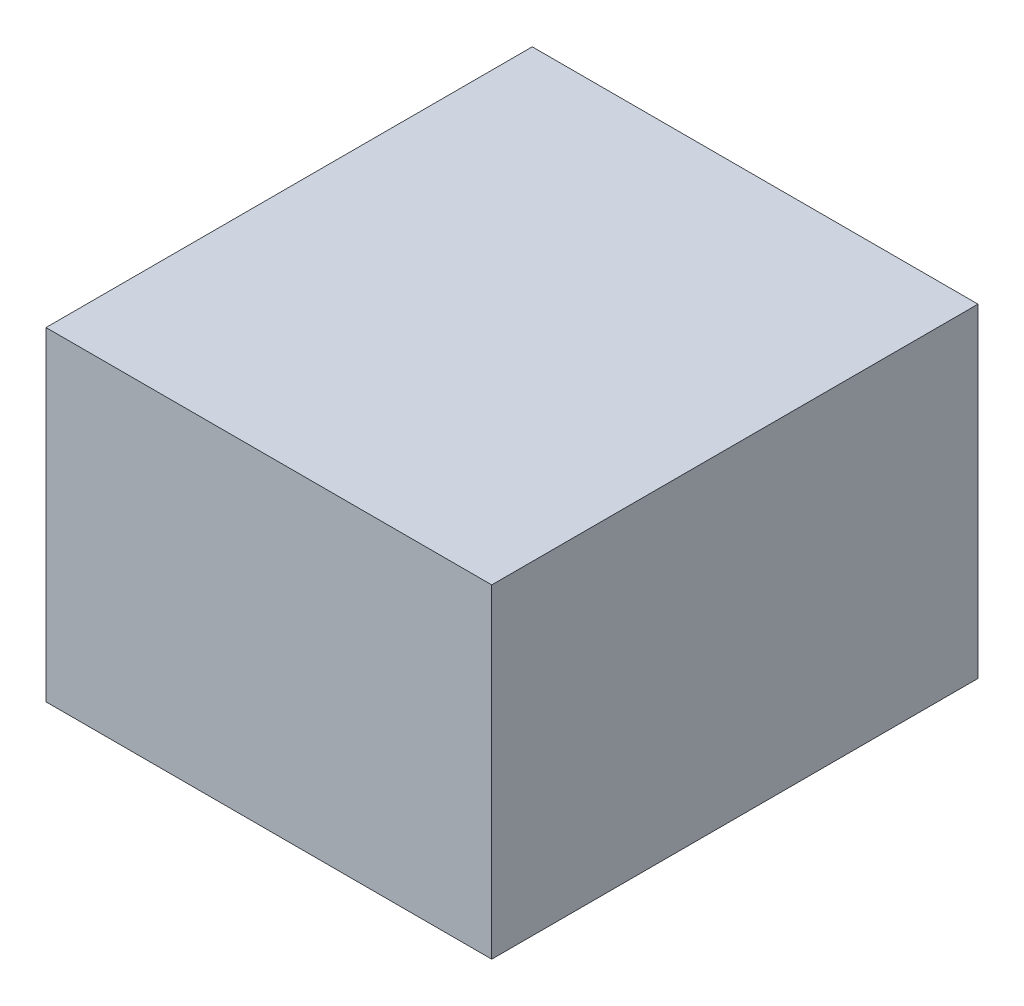
ISO-10303-21;
HEADER;
FILE_DESCRIPTION(('STEP AP214'),'2;1');
FILE_NAME('part.step','',(''),(''),'','','');
FILE_SCHEMA(('AUTOMOTIVE_DESIGN { 1 0 10303 214 1 1 1 1 }'));
ENDSEC;
DATA;
#1=APPLICATION_CONTEXT('core data for automotive mechanical design processes');
#2=APPLICATION_PROTOCOL_DEFINITION('international standard','automotive_design',2000,#1);
#3=PRODUCT_CONTEXT('',#1,'mechanical');
#4=PRODUCT('Part','Part','',(#3));
#5=PRODUCT_RELATED_PRODUCT_CATEGORY('part','',(#4));
#6=PRODUCT_DEFINITION_FORMATION('','',#4);
#7=PRODUCT_DEFINITION_CONTEXT('part definition',#1,'design');
#8=PRODUCT_DEFINITION('design','',#6,#7);
#9=PRODUCT_DEFINITION_SHAPE('','',#8);
#10=(LENGTH_UNIT() NAMED_UNIT(*) SI_UNIT(.MILLI.,.METRE.));
#11=(NAMED_UNIT(*) PLANE_ANGLE_UNIT() SI_UNIT($,.RADIAN.));
#12=(NAMED_UNIT(*) SI_UNIT($,.STERADIAN.) SOLID_ANGLE_UNIT());
#13=UNCERTAINTY_MEASURE_WITH_UNIT(LENGTH_MEASURE(1.E-05),#10,'distance_accuracy_value','');
#14=(GEOMETRIC_REPRESENTATION_CONTEXT(3) GLOBAL_UNCERTAINTY_ASSIGNED_CONTEXT((#13)) GLOBAL_UNIT_ASSIGNED_CONTEXT((#10,
#11,#12)) REPRESENTATION_CONTEXT('',''));
#15=CARTESIAN_POINT('',(0.,0.,0.));
#16=DIRECTION('',(0.,0.,1.));
#17=DIRECTION('',(1.,0.,0.));
#18=AXIS2_PLACEMENT_3D('',#15,#16,#17);
#19=CARTESIAN_POINT('',(-45.72,50.8,-36.576));
#20=DIRECTION('',(1.,0.,0.));
#21=DIRECTION('',(0.,0.,-1.));
#22=AXIS2_PLACEMENT_3D('',#19,#20,#21);
#23=PLANE('',#22);
#24=DIRECTION('',(0.,0.,1.));
#25=VECTOR('',#24,1.);
#26=CARTESIAN_POINT('',(-45.72,0.,-36.576));
#27=LINE('',#26,#25);
#28=CARTESIAN_POINT('',(-45.72,0.,-36.576));
#29=VERTEX_POINT('',#28);
#30=CARTESIAN_POINT('',(-45.72,0.,39.624));
#31=VERTEX_POINT('',#30);
#32=EDGE_CURVE('E96',#29,#31,#27,.T.);
#33=ORIENTED_EDGE('',*,*,#32,.T.);
#34=DIRECTION('',(0.,-1.,0.));
#35=VECTOR('',#34,1.);
#36=CARTESIAN_POINT('',(-45.72,50.8,39.624));
#37=LINE('',#36,#35);
#38=CARTESIAN_POINT('',(-45.72,50.8,39.624));
#39=VERTEX_POINT('',#38);
#40=EDGE_CURVE('E11',#39,#31,#37,.T.);
#41=ORIENTED_EDGE('',*,*,#40,.F.);
#42=DIRECTION('',(0.,0.,1.));
#43=VECTOR('',#42,1.);
#44=CARTESIAN_POINT('',(-45.72,50.8,-36.576));
#45=LINE('',#44,#43);
#46=CARTESIAN_POINT('',(-45.72,50.8,-36.576));
#47=VERTEX_POINT('',#46);
#48=EDGE_CURVE('E84',#47,#39,#45,.T.);
#49=ORIENTED_EDGE('',*,*,#48,.F.);
#50=DIRECTION('',(0.,-1.,0.));
#51=VECTOR('',#50,1.);
#52=CARTESIAN_POINT('',(-45.72,50.8,-36.576));
#53=LINE('',#52,#51);
#54=EDGE_CURVE('E92',#47,#29,#53,.T.);
#55=ORIENTED_EDGE('',*,*,#54,.T.);
#56=EDGE_LOOP('',(#33,#41,#49,#55));
#57=FACE_BOUND('',#56,.T.);
#58=ADVANCED_FACE('F33',(#57),#23,.F.);
#59=CARTESIAN_POINT('',(-45.72,50.8,39.624));
#60=DIRECTION('',(0.,0.,-1.));
#61=DIRECTION('',(-1.,0.,0.));
#62=AXIS2_PLACEMENT_3D('',#59,#60,#61);
#63=PLANE('',#62);
#64=DIRECTION('',(1.,0.,0.));
#65=VECTOR('',#64,1.);
#66=CARTESIAN_POINT('',(-45.72,0.,39.624));
#67=LINE('',#66,#65);
#68=CARTESIAN_POINT('',(24.13,0.,39.624));
#69=VERTEX_POINT('',#68);
#70=EDGE_CURVE('E88',#31,#69,#67,.T.);
#71=ORIENTED_EDGE('',*,*,#70,.T.);
#72=DIRECTION('',(0.,-1.,0.));
#73=VECTOR('',#72,1.);
#74=CARTESIAN_POINT('',(24.13,50.8,39.624));
#75=LINE('',#74,#73);
#76=CARTESIAN_POINT('',(24.13,50.8,39.624));
#77=VERTEX_POINT('',#76);
#78=EDGE_CURVE('E41',#77,#69,#75,.T.);
#79=ORIENTED_EDGE('',*,*,#78,.F.);
#80=DIRECTION('',(1.,0.,0.));
#81=VECTOR('',#80,1.);
#82=CARTESIAN_POINT('',(-45.72,50.8,39.624));
#83=LINE('',#82,#81);
#84=EDGE_CURVE('E79',#39,#77,#83,.T.);
#85=ORIENTED_EDGE('',*,*,#84,.F.);
#86=ORIENTED_EDGE('',*,*,#40,.T.);
#87=EDGE_LOOP('',(#71,#79,#85,#86));
#88=FACE_BOUND('',#87,.T.);
#89=ADVANCED_FACE('F87',(#88),#63,.F.);
#90=CARTESIAN_POINT('',(24.13,50.8,-36.576));
#91=DIRECTION('',(-1.,0.,0.));
#92=DIRECTION('',(0.,0.,1.));
#93=AXIS2_PLACEMENT_3D('',#90,#91,#92);
#94=PLANE('',#93);
#95=DIRECTION('',(0.,0.,-1.));
#96=VECTOR('',#95,1.);
#97=CARTESIAN_POINT('',(24.13,0.,-36.576));
#98=LINE('',#97,#96);
#99=CARTESIAN_POINT('',(24.13,0.,-36.576));
#100=VERTEX_POINT('',#99);
#101=EDGE_CURVE('E66',#69,#100,#98,.T.);
#102=ORIENTED_EDGE('',*,*,#101,.T.);
#103=DIRECTION('',(0.,-1.,0.));
#104=VECTOR('',#103,1.);
#105=CARTESIAN_POINT('',(24.13,50.8,-36.576));
#106=LINE('',#105,#104);
#107=CARTESIAN_POINT('',(24.13,50.8,-36.576));
#108=VERTEX_POINT('',#107);
#109=EDGE_CURVE('E89',#108,#100,#106,.T.);
#110=ORIENTED_EDGE('',*,*,#109,.F.);
#111=DIRECTION('',(0.,0.,-1.));
#112=VECTOR('',#111,1.);
#113=CARTESIAN_POINT('',(24.13,50.8,-36.576));
#114=LINE('',#113,#112);
#115=EDGE_CURVE('E82',#77,#108,#114,.T.);
#116=ORIENTED_EDGE('',*,*,#115,.F.);
#117=ORIENTED_EDGE('',*,*,#78,.T.);
#118=EDGE_LOOP('',(#102,#110,#116,#117));
#119=FACE_BOUND('',#118,.T.);
#120=ADVANCED_FACE('F90',(#119),#94,.F.);
#121=CARTESIAN_POINT('',(-45.72,50.8,-36.576));
#122=DIRECTION('',(0.,0.,1.));
#123=DIRECTION('',(1.,0.,0.));
#124=AXIS2_PLACEMENT_3D('',#121,#122,#123);
#125=PLANE('',#124);
#126=DIRECTION('',(-1.,0.,0.));
#127=VECTOR('',#126,1.);
#128=CARTESIAN_POINT('',(-45.72,0.,-36.576));
#129=LINE('',#128,#127);
#130=EDGE_CURVE('E72',#100,#29,#129,.T.);
#131=ORIENTED_EDGE('',*,*,#130,.T.);
#132=ORIENTED_EDGE('',*,*,#54,.F.);
#133=DIRECTION('',(-1.,0.,0.));
#134=VECTOR('',#133,1.);
#135=CARTESIAN_POINT('',(-45.72,50.8,-36.576));
#136=LINE('',#135,#134);
#137=EDGE_CURVE('E49',#108,#47,#136,.T.);
#138=ORIENTED_EDGE('',*,*,#137,.F.);
#139=ORIENTED_EDGE('',*,*,#109,.T.);
#140=EDGE_LOOP('',(#131,#132,#138,#139));
#141=FACE_BOUND('',#140,.T.);
#142=ADVANCED_FACE('F103',(#141),#125,.F.);
#143=CARTESIAN_POINT('',(0.,50.8,0.));
#144=DIRECTION('',(0.,1.,0.));
#145=DIRECTION('',(0.,0.,1.));
#146=AXIS2_PLACEMENT_3D('',#143,#144,#145);
#147=PLANE('',#146);
#148=ORIENTED_EDGE('',*,*,#48,.T.);
#149=ORIENTED_EDGE('',*,*,#84,.T.);
#150=ORIENTED_EDGE('',*,*,#115,.T.);
#151=ORIENTED_EDGE('',*,*,#137,.T.);
#152=EDGE_LOOP('',(#148,#149,#150,#151));
#153=FACE_BOUND('',#152,.T.);
#154=ADVANCED_FACE('F80',(#153),#147,.T.);
#155=CARTESIAN_POINT('',(0.,0.,0.));
#156=DIRECTION('',(0.,1.,0.));
#157=DIRECTION('',(0.,0.,1.));
#158=AXIS2_PLACEMENT_3D('',#155,#156,#157);
#159=PLANE('',#158);
#160=ORIENTED_EDGE('',*,*,#32,.F.);
#161=ORIENTED_EDGE('',*,*,#130,.F.);
#162=ORIENTED_EDGE('',*,*,#101,.F.);
#163=ORIENTED_EDGE('',*,*,#70,.F.);
#164=EDGE_LOOP('',(#160,#161,#162,#163));
#165=FACE_BOUND('',#164,.T.);
#166=ADVANCED_FACE('F106',(#165),#159,.F.);
#167=CLOSED_SHELL('',(#58,#89,#120,#142,#154,#166));
#168=MANIFOLD_SOLID_BREP('B2',#167);
#169=ADVANCED_BREP_SHAPE_REPRESENTATION('',(#18,#168),#14);
#170=SHAPE_DEFINITION_REPRESENTATION(#9,#169);
ENDSEC;
END-ISO-10303-21;
